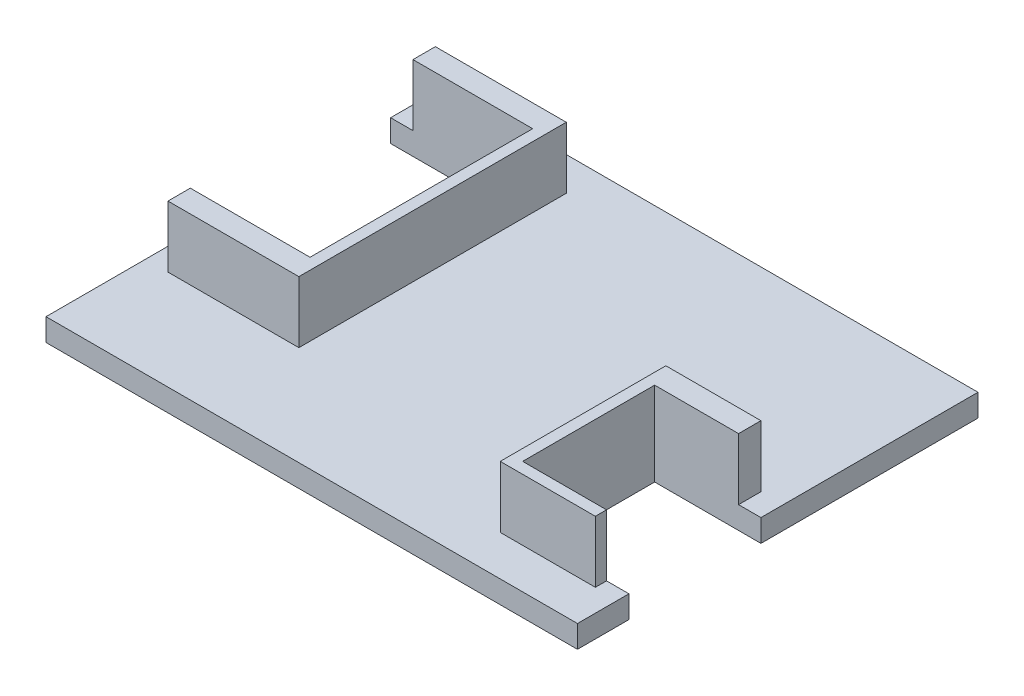
ISO-10303-21;
HEADER;
FILE_DESCRIPTION(('STEP AP214'),'2;1');
FILE_NAME('part.step','',(''),(''),'','','');
FILE_SCHEMA(('AUTOMOTIVE_DESIGN { 1 0 10303 214 1 1 1 1 }'));
ENDSEC;
DATA;
#1=APPLICATION_CONTEXT('core data for automotive mechanical design processes');
#2=APPLICATION_PROTOCOL_DEFINITION('international standard','automotive_design',2000,#1);
#3=PRODUCT_CONTEXT('',#1,'mechanical');
#4=PRODUCT('Part','Part','',(#3));
#5=PRODUCT_RELATED_PRODUCT_CATEGORY('part','',(#4));
#6=PRODUCT_DEFINITION_FORMATION('','',#4);
#7=PRODUCT_DEFINITION_CONTEXT('part definition',#1,'design');
#8=PRODUCT_DEFINITION('design','',#6,#7);
#9=PRODUCT_DEFINITION_SHAPE('','',#8);
#10=(LENGTH_UNIT() NAMED_UNIT(*) SI_UNIT(.MILLI.,.METRE.));
#11=(NAMED_UNIT(*) PLANE_ANGLE_UNIT() SI_UNIT($,.RADIAN.));
#12=(NAMED_UNIT(*) SI_UNIT($,.STERADIAN.) SOLID_ANGLE_UNIT());
#13=UNCERTAINTY_MEASURE_WITH_UNIT(LENGTH_MEASURE(1.E-05),#10,'distance_accuracy_value','');
#14=(GEOMETRIC_REPRESENTATION_CONTEXT(3) GLOBAL_UNCERTAINTY_ASSIGNED_CONTEXT((#13)) GLOBAL_UNIT_ASSIGNED_CONTEXT((#10,
#11,#12)) REPRESENTATION_CONTEXT('',''));
#15=CARTESIAN_POINT('',(0.,0.,0.));
#16=DIRECTION('',(0.,0.,1.));
#17=DIRECTION('',(1.,0.,0.));
#18=AXIS2_PLACEMENT_3D('',#15,#16,#17);
#19=CARTESIAN_POINT('',(0.,2.,0.));
#20=DIRECTION('',(0.,-1.,0.));
#21=DIRECTION('',(0.,0.,-1.));
#22=AXIS2_PLACEMENT_3D('',#19,#20,#21);
#23=PLANE('',#22);
#24=DIRECTION('',(0.,0.,1.));
#25=VECTOR('',#24,1.);
#26=CARTESIAN_POINT('',(2.,2.,-10.9));
#27=LINE('',#26,#25);
#28=CARTESIAN_POINT('',(2.,2.,-10.9));
#29=VERTEX_POINT('',#28);
#30=CARTESIAN_POINT('',(2.,2.,-8.9));
#31=VERTEX_POINT('',#30);
#32=EDGE_CURVE('E236',#29,#31,#27,.T.);
#33=ORIENTED_EDGE('',*,*,#32,.F.);
#34=DIRECTION('',(1.,0.,0.));
#35=VECTOR('',#34,1.);
#36=CARTESIAN_POINT('',(0.,2.,-10.9));
#37=LINE('',#36,#35);
#38=CARTESIAN_POINT('',(0.,2.,-10.9));
#39=VERTEX_POINT('',#38);
#40=EDGE_CURVE('E344',#39,#29,#37,.T.);
#41=ORIENTED_EDGE('',*,*,#40,.F.);
#42=DIRECTION('',(0.,0.,1.));
#43=VECTOR('',#42,1.);
#44=CARTESIAN_POINT('',(0.,2.,0.));
#45=LINE('',#44,#43);
#46=CARTESIAN_POINT('',(0.,2.,0.));
#47=VERTEX_POINT('',#46);
#48=EDGE_CURVE('E391',#39,#47,#45,.T.);
#49=ORIENTED_EDGE('',*,*,#48,.T.);
#50=DIRECTION('',(1.,0.,0.));
#51=VECTOR('',#50,1.);
#52=CARTESIAN_POINT('',(0.,2.,0.));
#53=LINE('',#52,#51);
#54=CARTESIAN_POINT('',(47.5,2.,0.));
#55=VERTEX_POINT('',#54);
#56=EDGE_CURVE('E390',#47,#55,#53,.T.);
#57=ORIENTED_EDGE('',*,*,#56,.T.);
#58=DIRECTION('',(0.,0.,-1.));
#59=VECTOR('',#58,1.);
#60=CARTESIAN_POINT('',(47.5,2.,0.));
#61=LINE('',#60,#59);
#62=CARTESIAN_POINT('',(47.5,2.,-4.6));
#63=VERTEX_POINT('',#62);
#64=EDGE_CURVE('E395',#55,#63,#61,.T.);
#65=ORIENTED_EDGE('',*,*,#64,.T.);
#66=DIRECTION('',(1.,0.,0.));
#67=VECTOR('',#66,1.);
#68=CARTESIAN_POINT('',(47.5,2.,-4.6));
#69=LINE('',#68,#67);
#70=CARTESIAN_POINT('',(45.5,2.,-4.6));
#71=VERTEX_POINT('',#70);
#72=EDGE_CURVE('E369',#71,#63,#69,.T.);
#73=ORIENTED_EDGE('',*,*,#72,.F.);
#74=DIRECTION('',(0.,0.,-1.));
#75=VECTOR('',#74,1.);
#76=CARTESIAN_POINT('',(45.5,2.,-4.6));
#77=LINE('',#76,#75);
#78=CARTESIAN_POINT('',(45.5,2.,-3.6));
#79=VERTEX_POINT('',#78);
#80=EDGE_CURVE('E313',#79,#71,#77,.T.);
#81=ORIENTED_EDGE('',*,*,#80,.F.);
#82=DIRECTION('',(1.,0.,0.));
#83=VECTOR('',#82,1.);
#84=CARTESIAN_POINT('',(37.,2.,-3.6));
#85=LINE('',#84,#83);
#86=CARTESIAN_POINT('',(37.,2.,-3.6));
#87=VERTEX_POINT('',#86);
#88=EDGE_CURVE('E308',#87,#79,#85,.T.);
#89=ORIENTED_EDGE('',*,*,#88,.F.);
#90=DIRECTION('',(0.,0.,1.));
#91=VECTOR('',#90,1.);
#92=CARTESIAN_POINT('',(37.,2.,-16.4));
#93=LINE('',#92,#91);
#94=CARTESIAN_POINT('',(37.,2.,-18.4));
#95=VERTEX_POINT('',#94);
#96=EDGE_CURVE('E336',#95,#87,#93,.T.);
#97=ORIENTED_EDGE('',*,*,#96,.F.);
#98=DIRECTION('',(-1.,0.,0.));
#99=VECTOR('',#98,1.);
#100=CARTESIAN_POINT('',(37.,2.,-18.4));
#101=LINE('',#100,#99);
#102=CARTESIAN_POINT('',(45.5,2.,-18.4));
#103=VERTEX_POINT('',#102);
#104=EDGE_CURVE('E285',#103,#95,#101,.T.);
#105=ORIENTED_EDGE('',*,*,#104,.F.);
#106=DIRECTION('',(0.,0.,-1.));
#107=VECTOR('',#106,1.);
#108=CARTESIAN_POINT('',(45.5,2.,-18.4));
#109=LINE('',#108,#107);
#110=CARTESIAN_POINT('',(45.5,2.,-16.4));
#111=VERTEX_POINT('',#110);
#112=EDGE_CURVE('E280',#111,#103,#109,.T.);
#113=ORIENTED_EDGE('',*,*,#112,.F.);
#114=DIRECTION('',(-1.,0.,0.));
#115=VECTOR('',#114,1.);
#116=CARTESIAN_POINT('',(47.5,2.,-16.4));
#117=LINE('',#116,#115);
#118=CARTESIAN_POINT('',(47.5,2.,-16.4));
#119=VERTEX_POINT('',#118);
#120=EDGE_CURVE('E358',#119,#111,#117,.T.);
#121=ORIENTED_EDGE('',*,*,#120,.F.);
#122=CARTESIAN_POINT('',(47.5,2.,-35.8));
#123=VERTEX_POINT('',#122);
#124=EDGE_CURVE('E394',#119,#123,#61,.T.);
#125=ORIENTED_EDGE('',*,*,#124,.T.);
#126=DIRECTION('',(-1.,0.,0.));
#127=VECTOR('',#126,1.);
#128=CARTESIAN_POINT('',(0.,2.,-35.8));
#129=LINE('',#128,#127);
#130=CARTESIAN_POINT('',(0.,2.,-35.8));
#131=VERTEX_POINT('',#130);
#132=EDGE_CURVE('E399',#123,#131,#129,.T.);
#133=ORIENTED_EDGE('',*,*,#132,.T.);
#134=CARTESIAN_POINT('',(0.,2.,-30.8));
#135=VERTEX_POINT('',#134);
#136=EDGE_CURVE('E386',#131,#135,#45,.T.);
#137=ORIENTED_EDGE('',*,*,#136,.T.);
#138=DIRECTION('',(-1.,0.,0.));
#139=VECTOR('',#138,1.);
#140=CARTESIAN_POINT('',(0.,2.,-30.8));
#141=LINE('',#140,#139);
#142=CARTESIAN_POINT('',(2.,2.,-30.8));
#143=VERTEX_POINT('',#142);
#144=EDGE_CURVE('E350',#143,#135,#141,.T.);
#145=ORIENTED_EDGE('',*,*,#144,.F.);
#146=DIRECTION('',(0.,0.,1.));
#147=VECTOR('',#146,1.);
#148=CARTESIAN_POINT('',(2.,2.,-32.8));
#149=LINE('',#148,#147);
#150=CARTESIAN_POINT('',(2.,2.,-32.8));
#151=VERTEX_POINT('',#150);
#152=EDGE_CURVE('E63',#151,#143,#149,.T.);
#153=ORIENTED_EDGE('',*,*,#152,.F.);
#154=DIRECTION('',(-1.,0.,0.));
#155=VECTOR('',#154,1.);
#156=CARTESIAN_POINT('',(2.,2.,-32.8));
#157=LINE('',#156,#155);
#158=CARTESIAN_POINT('',(13.7,2.,-32.8));
#159=VERTEX_POINT('',#158);
#160=EDGE_CURVE('E263',#159,#151,#157,.T.);
#161=ORIENTED_EDGE('',*,*,#160,.F.);
#162=DIRECTION('',(0.,0.,-1.));
#163=VECTOR('',#162,1.);
#164=CARTESIAN_POINT('',(13.7,2.,-32.8));
#165=LINE('',#164,#163);
#166=CARTESIAN_POINT('',(13.7,2.,-8.9));
#167=VERTEX_POINT('',#166);
#168=EDGE_CURVE('E239',#167,#159,#165,.T.);
#169=ORIENTED_EDGE('',*,*,#168,.F.);
#170=DIRECTION('',(1.,0.,0.));
#171=VECTOR('',#170,1.);
#172=CARTESIAN_POINT('',(2.,2.,-8.9));
#173=LINE('',#172,#171);
#174=EDGE_CURVE('E232',#31,#167,#173,.T.);
#175=ORIENTED_EDGE('',*,*,#174,.F.);
#176=EDGE_LOOP('',(#33,#41,#49,#57,#65,#73,#81,#89,#97,#105,#113,#121,#125,#133,#137,#145,#153,
#161,#169,#175));
#177=FACE_BOUND('',#176,.T.);
#178=ADVANCED_FACE('F47',(#177),#23,.F.);
#179=CARTESIAN_POINT('',(0.,2.,0.));
#180=DIRECTION('',(1.,0.,0.));
#181=DIRECTION('',(0.,0.,-1.));
#182=AXIS2_PLACEMENT_3D('',#179,#180,#181);
#183=PLANE('',#182);
#184=DIRECTION('',(0.,0.,1.));
#185=VECTOR('',#184,1.);
#186=CARTESIAN_POINT('',(0.,0.,0.));
#187=LINE('',#186,#185);
#188=CARTESIAN_POINT('',(0.,0.,-35.8));
#189=VERTEX_POINT('',#188);
#190=CARTESIAN_POINT('',(0.,0.,-30.8));
#191=VERTEX_POINT('',#190);
#192=EDGE_CURVE('E403',#189,#191,#187,.T.);
#193=ORIENTED_EDGE('',*,*,#192,.T.);
#194=DIRECTION('',(0.,1.,0.));
#195=VECTOR('',#194,1.);
#196=CARTESIAN_POINT('',(0.,-8.,-30.8));
#197=LINE('',#196,#195);
#198=EDGE_CURVE('E354',#191,#135,#197,.T.);
#199=ORIENTED_EDGE('',*,*,#198,.T.);
#200=ORIENTED_EDGE('',*,*,#136,.F.);
#201=DIRECTION('',(0.,-1.,0.));
#202=VECTOR('',#201,1.);
#203=CARTESIAN_POINT('',(0.,2.,-35.8));
#204=LINE('',#203,#202);
#205=EDGE_CURVE('E402',#131,#189,#204,.T.);
#206=ORIENTED_EDGE('',*,*,#205,.T.);
#207=EDGE_LOOP('',(#193,#199,#200,#206));
#208=FACE_BOUND('',#207,.T.);
#209=ADVANCED_FACE('F482',(#208),#183,.F.);
#210=CARTESIAN_POINT('',(47.5,2.,0.));
#211=DIRECTION('',(-1.,0.,0.));
#212=DIRECTION('',(0.,0.,1.));
#213=AXIS2_PLACEMENT_3D('',#210,#211,#212);
#214=PLANE('',#213);
#215=DIRECTION('',(0.,0.,-1.));
#216=VECTOR('',#215,1.);
#217=CARTESIAN_POINT('',(47.5,0.,0.));
#218=LINE('',#217,#216);
#219=CARTESIAN_POINT('',(47.5,0.,0.));
#220=VERTEX_POINT('',#219);
#221=CARTESIAN_POINT('',(47.5,0.,-4.6));
#222=VERTEX_POINT('',#221);
#223=EDGE_CURVE('E411',#220,#222,#218,.T.);
#224=ORIENTED_EDGE('',*,*,#223,.T.);
#225=DIRECTION('',(0.,1.,0.));
#226=VECTOR('',#225,1.);
#227=CARTESIAN_POINT('',(47.5,-8.,-4.6));
#228=LINE('',#227,#226);
#229=EDGE_CURVE('E373',#222,#63,#228,.T.);
#230=ORIENTED_EDGE('',*,*,#229,.T.);
#231=ORIENTED_EDGE('',*,*,#64,.F.);
#232=DIRECTION('',(0.,-1.,0.));
#233=VECTOR('',#232,1.);
#234=CARTESIAN_POINT('',(47.5,2.,0.));
#235=LINE('',#234,#233);
#236=EDGE_CURVE('E425',#55,#220,#235,.T.);
#237=ORIENTED_EDGE('',*,*,#236,.T.);
#238=EDGE_LOOP('',(#224,#230,#231,#237));
#239=FACE_BOUND('',#238,.T.);
#240=ADVANCED_FACE('F518',(#239),#214,.F.);
#241=ORIENTED_EDGE('',*,*,#48,.F.);
#242=DIRECTION('',(0.,1.,0.));
#243=VECTOR('',#242,1.);
#244=CARTESIAN_POINT('',(0.,-8.,-10.9));
#245=LINE('',#244,#243);
#246=CARTESIAN_POINT('',(0.,0.,-10.9));
#247=VERTEX_POINT('',#246);
#248=EDGE_CURVE('E353',#247,#39,#245,.T.);
#249=ORIENTED_EDGE('',*,*,#248,.F.);
#250=CARTESIAN_POINT('',(0.,0.,0.));
#251=VERTEX_POINT('',#250);
#252=EDGE_CURVE('E377',#247,#251,#187,.T.);
#253=ORIENTED_EDGE('',*,*,#252,.T.);
#254=DIRECTION('',(0.,-1.,0.));
#255=VECTOR('',#254,1.);
#256=CARTESIAN_POINT('',(0.,2.,0.));
#257=LINE('',#256,#255);
#258=EDGE_CURVE('E429',#47,#251,#257,.T.);
#259=ORIENTED_EDGE('',*,*,#258,.F.);
#260=EDGE_LOOP('',(#241,#249,#253,#259));
#261=FACE_BOUND('',#260,.T.);
#262=ADVANCED_FACE('F49',(#261),#183,.F.);
#263=CARTESIAN_POINT('',(0.,2.,0.));
#264=DIRECTION('',(0.,0.,-1.));
#265=DIRECTION('',(-1.,0.,0.));
#266=AXIS2_PLACEMENT_3D('',#263,#264,#265);
#267=PLANE('',#266);
#268=DIRECTION('',(1.,0.,0.));
#269=VECTOR('',#268,1.);
#270=CARTESIAN_POINT('',(0.,0.,0.));
#271=LINE('',#270,#269);
#272=EDGE_CURVE('E407',#251,#220,#271,.T.);
#273=ORIENTED_EDGE('',*,*,#272,.T.);
#274=ORIENTED_EDGE('',*,*,#236,.F.);
#275=ORIENTED_EDGE('',*,*,#56,.F.);
#276=ORIENTED_EDGE('',*,*,#258,.T.);
#277=EDGE_LOOP('',(#273,#274,#275,#276));
#278=FACE_BOUND('',#277,.T.);
#279=ADVANCED_FACE('F520',(#278),#267,.F.);
#280=ORIENTED_EDGE('',*,*,#124,.F.);
#281=DIRECTION('',(0.,1.,0.));
#282=VECTOR('',#281,1.);
#283=CARTESIAN_POINT('',(47.5,-8.,-16.4));
#284=LINE('',#283,#282);
#285=CARTESIAN_POINT('',(47.5,0.,-16.4));
#286=VERTEX_POINT('',#285);
#287=EDGE_CURVE('E372',#286,#119,#284,.T.);
#288=ORIENTED_EDGE('',*,*,#287,.F.);
#289=CARTESIAN_POINT('',(47.5,0.,-35.8));
#290=VERTEX_POINT('',#289);
#291=EDGE_CURVE('E410',#286,#290,#218,.T.);
#292=ORIENTED_EDGE('',*,*,#291,.T.);
#293=DIRECTION('',(0.,-1.,0.));
#294=VECTOR('',#293,1.);
#295=CARTESIAN_POINT('',(47.5,2.,-35.8));
#296=LINE('',#295,#294);
#297=EDGE_CURVE('E421',#123,#290,#296,.T.);
#298=ORIENTED_EDGE('',*,*,#297,.F.);
#299=EDGE_LOOP('',(#280,#288,#292,#298));
#300=FACE_BOUND('',#299,.T.);
#301=ADVANCED_FACE('F473',(#300),#214,.F.);
#302=CARTESIAN_POINT('',(0.,2.,-35.8));
#303=DIRECTION('',(0.,0.,1.));
#304=DIRECTION('',(1.,0.,0.));
#305=AXIS2_PLACEMENT_3D('',#302,#303,#304);
#306=PLANE('',#305);
#307=DIRECTION('',(-1.,0.,0.));
#308=VECTOR('',#307,1.);
#309=CARTESIAN_POINT('',(0.,0.,-35.8));
#310=LINE('',#309,#308);
#311=EDGE_CURVE('E415',#290,#189,#310,.T.);
#312=ORIENTED_EDGE('',*,*,#311,.T.);
#313=ORIENTED_EDGE('',*,*,#205,.F.);
#314=ORIENTED_EDGE('',*,*,#132,.F.);
#315=ORIENTED_EDGE('',*,*,#297,.T.);
#316=EDGE_LOOP('',(#312,#313,#314,#315));
#317=FACE_BOUND('',#316,.T.);
#318=ADVANCED_FACE('F478',(#317),#306,.F.);
#319=CARTESIAN_POINT('',(0.,0.,0.));
#320=DIRECTION('',(0.,-1.,0.));
#321=DIRECTION('',(0.,0.,-1.));
#322=AXIS2_PLACEMENT_3D('',#319,#320,#321);
#323=PLANE('',#322);
#324=DIRECTION('',(1.,0.,0.));
#325=VECTOR('',#324,1.);
#326=CARTESIAN_POINT('',(0.,0.,-30.8));
#327=LINE('',#326,#325);
#328=CARTESIAN_POINT('',(12.7,0.,-30.8));
#329=VERTEX_POINT('',#328);
#330=EDGE_CURVE('E11',#191,#329,#327,.T.);
#331=ORIENTED_EDGE('',*,*,#330,.F.);
#332=ORIENTED_EDGE('',*,*,#192,.F.);
#333=ORIENTED_EDGE('',*,*,#311,.F.);
#334=ORIENTED_EDGE('',*,*,#291,.F.);
#335=DIRECTION('',(1.,0.,0.));
#336=VECTOR('',#335,1.);
#337=CARTESIAN_POINT('',(0.,0.,-16.4));
#338=LINE('',#337,#336);
#339=CARTESIAN_POINT('',(38.,0.,-16.4));
#340=VERTEX_POINT('',#339);
#341=EDGE_CURVE('E433',#340,#286,#338,.T.);
#342=ORIENTED_EDGE('',*,*,#341,.F.);
#343=DIRECTION('',(0.,0.,-1.));
#344=VECTOR('',#343,1.);
#345=CARTESIAN_POINT('',(38.,0.,0.));
#346=LINE('',#345,#344);
#347=CARTESIAN_POINT('',(38.,0.,-4.6));
#348=VERTEX_POINT('',#347);
#349=EDGE_CURVE('E436',#348,#340,#346,.T.);
#350=ORIENTED_EDGE('',*,*,#349,.F.);
#351=DIRECTION('',(-1.,0.,0.));
#352=VECTOR('',#351,1.);
#353=CARTESIAN_POINT('',(0.,0.,-4.6));
#354=LINE('',#353,#352);
#355=EDGE_CURVE('E440',#222,#348,#354,.T.);
#356=ORIENTED_EDGE('',*,*,#355,.F.);
#357=ORIENTED_EDGE('',*,*,#223,.F.);
#358=ORIENTED_EDGE('',*,*,#272,.F.);
#359=ORIENTED_EDGE('',*,*,#252,.F.);
#360=DIRECTION('',(-1.,0.,0.));
#361=VECTOR('',#360,1.);
#362=CARTESIAN_POINT('',(0.,0.,-10.9));
#363=LINE('',#362,#361);
#364=CARTESIAN_POINT('',(12.7,0.,-10.9));
#365=VERTEX_POINT('',#364);
#366=EDGE_CURVE('E443',#365,#247,#363,.T.);
#367=ORIENTED_EDGE('',*,*,#366,.F.);
#368=DIRECTION('',(0.,0.,1.));
#369=VECTOR('',#368,1.);
#370=CARTESIAN_POINT('',(12.7,0.,0.));
#371=LINE('',#370,#369);
#372=EDGE_CURVE('E56',#329,#365,#371,.T.);
#373=ORIENTED_EDGE('',*,*,#372,.F.);
#374=EDGE_LOOP('',(#331,#332,#333,#334,#342,#350,#356,#357,#358,#359,#367,#373));
#375=FACE_BOUND('',#374,.T.);
#376=ADVANCED_FACE('F455',(#375),#323,.T.);
#377=CARTESIAN_POINT('',(47.5,-8.,-4.6));
#378=DIRECTION('',(0.,0.,1.));
#379=DIRECTION('',(1.,0.,0.));
#380=AXIS2_PLACEMENT_3D('',#377,#378,#379);
#381=PLANE('',#380);
#382=ORIENTED_EDGE('',*,*,#355,.T.);
#383=DIRECTION('',(0.,1.,0.));
#384=VECTOR('',#383,1.);
#385=CARTESIAN_POINT('',(38.,-8.,-4.6));
#386=LINE('',#385,#384);
#387=CARTESIAN_POINT('',(38.,7.5,-4.6));
#388=VERTEX_POINT('',#387);
#389=EDGE_CURVE('E378',#348,#388,#386,.T.);
#390=ORIENTED_EDGE('',*,*,#389,.T.);
#391=DIRECTION('',(-1.,0.,0.));
#392=VECTOR('',#391,1.);
#393=CARTESIAN_POINT('',(37.,7.5,-4.6));
#394=LINE('',#393,#392);
#395=CARTESIAN_POINT('',(45.5,7.5,-4.6));
#396=VERTEX_POINT('',#395);
#397=EDGE_CURVE('E316',#396,#388,#394,.T.);
#398=ORIENTED_EDGE('',*,*,#397,.F.);
#399=DIRECTION('',(0.,-1.,0.));
#400=VECTOR('',#399,1.);
#401=CARTESIAN_POINT('',(45.5,7.5,-4.6));
#402=LINE('',#401,#400);
#403=EDGE_CURVE('E320',#396,#71,#402,.T.);
#404=ORIENTED_EDGE('',*,*,#403,.T.);
#405=ORIENTED_EDGE('',*,*,#72,.T.);
#406=ORIENTED_EDGE('',*,*,#229,.F.);
#407=EDGE_LOOP('',(#382,#390,#398,#404,#405,#406));
#408=FACE_BOUND('',#407,.T.);
#409=ADVANCED_FACE('F503',(#408),#381,.F.);
#410=CARTESIAN_POINT('',(38.,-8.,-16.4));
#411=DIRECTION('',(-1.,0.,0.));
#412=DIRECTION('',(0.,0.,1.));
#413=AXIS2_PLACEMENT_3D('',#410,#411,#412);
#414=PLANE('',#413);
#415=ORIENTED_EDGE('',*,*,#349,.T.);
#416=DIRECTION('',(0.,1.,0.));
#417=VECTOR('',#416,1.);
#418=CARTESIAN_POINT('',(38.,-8.,-16.4));
#419=LINE('',#418,#417);
#420=CARTESIAN_POINT('',(38.,7.5,-16.4));
#421=VERTEX_POINT('',#420);
#422=EDGE_CURVE('E381',#340,#421,#419,.T.);
#423=ORIENTED_EDGE('',*,*,#422,.T.);
#424=DIRECTION('',(0.,0.,-1.));
#425=VECTOR('',#424,1.);
#426=CARTESIAN_POINT('',(38.,7.5,-16.4));
#427=LINE('',#426,#425);
#428=EDGE_CURVE('E337',#388,#421,#427,.T.);
#429=ORIENTED_EDGE('',*,*,#428,.F.);
#430=ORIENTED_EDGE('',*,*,#389,.F.);
#431=EDGE_LOOP('',(#415,#423,#429,#430));
#432=FACE_BOUND('',#431,.T.);
#433=ADVANCED_FACE('F499',(#432),#414,.F.);
#434=CARTESIAN_POINT('',(47.5,-8.,-16.4));
#435=DIRECTION('',(0.,0.,-1.));
#436=DIRECTION('',(-1.,0.,0.));
#437=AXIS2_PLACEMENT_3D('',#434,#435,#436);
#438=PLANE('',#437);
#439=ORIENTED_EDGE('',*,*,#341,.T.);
#440=ORIENTED_EDGE('',*,*,#287,.T.);
#441=ORIENTED_EDGE('',*,*,#120,.T.);
#442=DIRECTION('',(0.,-1.,0.));
#443=VECTOR('',#442,1.);
#444=CARTESIAN_POINT('',(45.5,7.5,-16.4));
#445=LINE('',#444,#443);
#446=CARTESIAN_POINT('',(45.5,7.5,-16.4));
#447=VERTEX_POINT('',#446);
#448=EDGE_CURVE('E305',#447,#111,#445,.T.);
#449=ORIENTED_EDGE('',*,*,#448,.F.);
#450=DIRECTION('',(1.,0.,0.));
#451=VECTOR('',#450,1.);
#452=CARTESIAN_POINT('',(37.,7.5,-16.4));
#453=LINE('',#452,#451);
#454=EDGE_CURVE('E281',#421,#447,#453,.T.);
#455=ORIENTED_EDGE('',*,*,#454,.F.);
#456=ORIENTED_EDGE('',*,*,#422,.F.);
#457=EDGE_LOOP('',(#439,#440,#441,#449,#455,#456));
#458=FACE_BOUND('',#457,.T.);
#459=ADVANCED_FACE('F491',(#458),#438,.F.);
#460=CARTESIAN_POINT('',(0.,-8.,-30.8));
#461=DIRECTION('',(0.,0.,-1.));
#462=DIRECTION('',(-1.,0.,0.));
#463=AXIS2_PLACEMENT_3D('',#460,#461,#462);
#464=PLANE('',#463);
#465=ORIENTED_EDGE('',*,*,#330,.T.);
#466=DIRECTION('',(0.,1.,0.));
#467=VECTOR('',#466,1.);
#468=CARTESIAN_POINT('',(12.7,-8.,-30.8));
#469=LINE('',#468,#467);
#470=CARTESIAN_POINT('',(12.7,7.5,-30.8));
#471=VERTEX_POINT('',#470);
#472=EDGE_CURVE('E359',#329,#471,#469,.T.);
#473=ORIENTED_EDGE('',*,*,#472,.T.);
#474=DIRECTION('',(1.,0.,0.));
#475=VECTOR('',#474,1.);
#476=CARTESIAN_POINT('',(2.,7.5,-30.8));
#477=LINE('',#476,#475);
#478=CARTESIAN_POINT('',(2.,7.5,-30.8));
#479=VERTEX_POINT('',#478);
#480=EDGE_CURVE('E262',#479,#471,#477,.T.);
#481=ORIENTED_EDGE('',*,*,#480,.F.);
#482=DIRECTION('',(0.,-1.,0.));
#483=VECTOR('',#482,1.);
#484=CARTESIAN_POINT('',(2.,7.5,-30.8));
#485=LINE('',#484,#483);
#486=EDGE_CURVE('E277',#479,#143,#485,.T.);
#487=ORIENTED_EDGE('',*,*,#486,.T.);
#488=ORIENTED_EDGE('',*,*,#144,.T.);
#489=ORIENTED_EDGE('',*,*,#198,.F.);
#490=EDGE_LOOP('',(#465,#473,#481,#487,#488,#489));
#491=FACE_BOUND('',#490,.T.);
#492=ADVANCED_FACE('F611',(#491),#464,.F.);
#493=CARTESIAN_POINT('',(12.7,-8.,-30.8));
#494=DIRECTION('',(1.,0.,0.));
#495=DIRECTION('',(0.,0.,-1.));
#496=AXIS2_PLACEMENT_3D('',#493,#494,#495);
#497=PLANE('',#496);
#498=ORIENTED_EDGE('',*,*,#372,.T.);
#499=DIRECTION('',(0.,1.,0.));
#500=VECTOR('',#499,1.);
#501=CARTESIAN_POINT('',(12.7,-8.,-10.9));
#502=LINE('',#501,#500);
#503=CARTESIAN_POINT('',(12.7,7.5,-10.9));
#504=VERTEX_POINT('',#503);
#505=EDGE_CURVE('E71',#365,#504,#502,.T.);
#506=ORIENTED_EDGE('',*,*,#505,.T.);
#507=DIRECTION('',(0.,0.,1.));
#508=VECTOR('',#507,1.);
#509=CARTESIAN_POINT('',(12.7,7.5,-32.8));
#510=LINE('',#509,#508);
#511=EDGE_CURVE('E244',#471,#504,#510,.T.);
#512=ORIENTED_EDGE('',*,*,#511,.F.);
#513=ORIENTED_EDGE('',*,*,#472,.F.);
#514=EDGE_LOOP('',(#498,#506,#512,#513));
#515=FACE_BOUND('',#514,.T.);
#516=ADVANCED_FACE('F450',(#515),#497,.F.);
#517=CARTESIAN_POINT('',(0.,-8.,-10.9));
#518=DIRECTION('',(0.,0.,1.));
#519=DIRECTION('',(1.,0.,0.));
#520=AXIS2_PLACEMENT_3D('',#517,#518,#519);
#521=PLANE('',#520);
#522=ORIENTED_EDGE('',*,*,#366,.T.);
#523=ORIENTED_EDGE('',*,*,#248,.T.);
#524=ORIENTED_EDGE('',*,*,#40,.T.);
#525=DIRECTION('',(0.,-1.,0.));
#526=VECTOR('',#525,1.);
#527=CARTESIAN_POINT('',(2.,7.5,-10.9));
#528=LINE('',#527,#526);
#529=CARTESIAN_POINT('',(2.,7.5,-10.9));
#530=VERTEX_POINT('',#529);
#531=EDGE_CURVE('E246',#530,#29,#528,.T.);
#532=ORIENTED_EDGE('',*,*,#531,.F.);
#533=DIRECTION('',(-1.,0.,0.));
#534=VECTOR('',#533,1.);
#535=CARTESIAN_POINT('',(2.,7.5,-10.9));
#536=LINE('',#535,#534);
#537=EDGE_CURVE('E222',#504,#530,#536,.T.);
#538=ORIENTED_EDGE('',*,*,#537,.F.);
#539=ORIENTED_EDGE('',*,*,#505,.F.);
#540=EDGE_LOOP('',(#522,#523,#524,#532,#538,#539));
#541=FACE_BOUND('',#540,.T.);
#542=ADVANCED_FACE('F458',(#541),#521,.F.);
#543=CARTESIAN_POINT('',(37.,7.5,-16.4));
#544=DIRECTION('',(1.,0.,0.));
#545=DIRECTION('',(0.,0.,-1.));
#546=AXIS2_PLACEMENT_3D('',#543,#544,#545);
#547=PLANE('',#546);
#548=ORIENTED_EDGE('',*,*,#96,.T.);
#549=DIRECTION('',(0.,-1.,0.));
#550=VECTOR('',#549,1.);
#551=CARTESIAN_POINT('',(37.,7.5,-3.6));
#552=LINE('',#551,#550);
#553=CARTESIAN_POINT('',(37.,7.5,-3.6));
#554=VERTEX_POINT('',#553);
#555=EDGE_CURVE('E332',#554,#87,#552,.T.);
#556=ORIENTED_EDGE('',*,*,#555,.F.);
#557=DIRECTION('',(0.,0.,1.));
#558=VECTOR('',#557,1.);
#559=CARTESIAN_POINT('',(37.,7.5,-16.4));
#560=LINE('',#559,#558);
#561=CARTESIAN_POINT('',(37.,7.5,-18.4));
#562=VERTEX_POINT('',#561);
#563=EDGE_CURVE('E341',#562,#554,#560,.T.);
#564=ORIENTED_EDGE('',*,*,#563,.F.);
#565=DIRECTION('',(0.,-1.,0.));
#566=VECTOR('',#565,1.);
#567=CARTESIAN_POINT('',(37.,7.5,-18.4));
#568=LINE('',#567,#566);
#569=EDGE_CURVE('E292',#562,#95,#568,.T.);
#570=ORIENTED_EDGE('',*,*,#569,.T.);
#571=EDGE_LOOP('',(#548,#556,#564,#570));
#572=FACE_BOUND('',#571,.T.);
#573=ADVANCED_FACE('F616',(#572),#547,.F.);
#574=CARTESIAN_POINT('',(0.,7.5,0.));
#575=DIRECTION('',(0.,-1.,0.));
#576=DIRECTION('',(0.,0.,-1.));
#577=AXIS2_PLACEMENT_3D('',#574,#575,#576);
#578=PLANE('',#577);
#579=ORIENTED_EDGE('',*,*,#428,.T.);
#580=ORIENTED_EDGE('',*,*,#454,.T.);
#581=DIRECTION('',(0.,0.,-1.));
#582=VECTOR('',#581,1.);
#583=CARTESIAN_POINT('',(45.5,7.5,-18.4));
#584=LINE('',#583,#582);
#585=CARTESIAN_POINT('',(45.5,7.5,-18.4));
#586=VERTEX_POINT('',#585);
#587=EDGE_CURVE('E284',#447,#586,#584,.T.);
#588=ORIENTED_EDGE('',*,*,#587,.T.);
#589=DIRECTION('',(-1.,0.,0.));
#590=VECTOR('',#589,1.);
#591=CARTESIAN_POINT('',(37.,7.5,-18.4));
#592=LINE('',#591,#590);
#593=EDGE_CURVE('E288',#586,#562,#592,.T.);
#594=ORIENTED_EDGE('',*,*,#593,.T.);
#595=ORIENTED_EDGE('',*,*,#563,.T.);
#596=DIRECTION('',(1.,0.,0.));
#597=VECTOR('',#596,1.);
#598=CARTESIAN_POINT('',(37.,7.5,-3.6));
#599=LINE('',#598,#597);
#600=CARTESIAN_POINT('',(45.5,7.5,-3.6));
#601=VERTEX_POINT('',#600);
#602=EDGE_CURVE('E309',#554,#601,#599,.T.);
#603=ORIENTED_EDGE('',*,*,#602,.T.);
#604=DIRECTION('',(0.,0.,-1.));
#605=VECTOR('',#604,1.);
#606=CARTESIAN_POINT('',(45.5,7.5,-4.6));
#607=LINE('',#606,#605);
#608=EDGE_CURVE('E312',#601,#396,#607,.T.);
#609=ORIENTED_EDGE('',*,*,#608,.T.);
#610=ORIENTED_EDGE('',*,*,#397,.T.);
#611=EDGE_LOOP('',(#579,#580,#588,#594,#595,#603,#609,#610));
#612=FACE_BOUND('',#611,.T.);
#613=ADVANCED_FACE('F505',(#612),#578,.F.);
#614=CARTESIAN_POINT('',(37.,7.5,-3.6));
#615=DIRECTION('',(0.,0.,-1.));
#616=DIRECTION('',(-1.,0.,0.));
#617=AXIS2_PLACEMENT_3D('',#614,#615,#616);
#618=PLANE('',#617);
#619=ORIENTED_EDGE('',*,*,#88,.T.);
#620=DIRECTION('',(0.,-1.,0.));
#621=VECTOR('',#620,1.);
#622=CARTESIAN_POINT('',(45.5,7.5,-3.6));
#623=LINE('',#622,#621);
#624=EDGE_CURVE('E328',#601,#79,#623,.T.);
#625=ORIENTED_EDGE('',*,*,#624,.F.);
#626=ORIENTED_EDGE('',*,*,#602,.F.);
#627=ORIENTED_EDGE('',*,*,#555,.T.);
#628=EDGE_LOOP('',(#619,#625,#626,#627));
#629=FACE_BOUND('',#628,.T.);
#630=ADVANCED_FACE('F582',(#629),#618,.F.);
#631=CARTESIAN_POINT('',(45.5,7.5,-4.6));
#632=DIRECTION('',(-1.,0.,0.));
#633=DIRECTION('',(0.,0.,1.));
#634=AXIS2_PLACEMENT_3D('',#631,#632,#633);
#635=PLANE('',#634);
#636=ORIENTED_EDGE('',*,*,#80,.T.);
#637=ORIENTED_EDGE('',*,*,#403,.F.);
#638=ORIENTED_EDGE('',*,*,#608,.F.);
#639=ORIENTED_EDGE('',*,*,#624,.T.);
#640=EDGE_LOOP('',(#636,#637,#638,#639));
#641=FACE_BOUND('',#640,.T.);
#642=ADVANCED_FACE('F511',(#641),#635,.F.);
#643=CARTESIAN_POINT('',(45.5,7.5,-18.4));
#644=DIRECTION('',(-1.,0.,0.));
#645=DIRECTION('',(0.,0.,1.));
#646=AXIS2_PLACEMENT_3D('',#643,#644,#645);
#647=PLANE('',#646);
#648=ORIENTED_EDGE('',*,*,#112,.T.);
#649=DIRECTION('',(0.,-1.,0.));
#650=VECTOR('',#649,1.);
#651=CARTESIAN_POINT('',(45.5,7.5,-18.4));
#652=LINE('',#651,#650);
#653=EDGE_CURVE('E301',#586,#103,#652,.T.);
#654=ORIENTED_EDGE('',*,*,#653,.F.);
#655=ORIENTED_EDGE('',*,*,#587,.F.);
#656=ORIENTED_EDGE('',*,*,#448,.T.);
#657=EDGE_LOOP('',(#648,#654,#655,#656));
#658=FACE_BOUND('',#657,.T.);
#659=ADVANCED_FACE('F595',(#658),#647,.F.);
#660=CARTESIAN_POINT('',(37.,7.5,-18.4));
#661=DIRECTION('',(0.,0.,1.));
#662=DIRECTION('',(1.,0.,0.));
#663=AXIS2_PLACEMENT_3D('',#660,#661,#662);
#664=PLANE('',#663);
#665=ORIENTED_EDGE('',*,*,#104,.T.);
#666=ORIENTED_EDGE('',*,*,#569,.F.);
#667=ORIENTED_EDGE('',*,*,#593,.F.);
#668=ORIENTED_EDGE('',*,*,#653,.T.);
#669=EDGE_LOOP('',(#665,#666,#667,#668));
#670=FACE_BOUND('',#669,.T.);
#671=ADVANCED_FACE('F632',(#670),#664,.F.);
#672=CARTESIAN_POINT('',(2.,7.5,-32.8));
#673=DIRECTION('',(1.,0.,0.));
#674=DIRECTION('',(0.,0.,-1.));
#675=AXIS2_PLACEMENT_3D('',#672,#673,#674);
#676=PLANE('',#675);
#677=ORIENTED_EDGE('',*,*,#152,.T.);
#678=ORIENTED_EDGE('',*,*,#486,.F.);
#679=DIRECTION('',(0.,0.,1.));
#680=VECTOR('',#679,1.);
#681=CARTESIAN_POINT('',(2.,7.5,-32.8));
#682=LINE('',#681,#680);
#683=CARTESIAN_POINT('',(2.,7.5,-32.8));
#684=VERTEX_POINT('',#683);
#685=EDGE_CURVE('E259',#684,#479,#682,.T.);
#686=ORIENTED_EDGE('',*,*,#685,.F.);
#687=DIRECTION('',(0.,-1.,0.));
#688=VECTOR('',#687,1.);
#689=CARTESIAN_POINT('',(2.,7.5,-32.8));
#690=LINE('',#689,#688);
#691=EDGE_CURVE('E270',#684,#151,#690,.T.);
#692=ORIENTED_EDGE('',*,*,#691,.T.);
#693=EDGE_LOOP('',(#677,#678,#686,#692));
#694=FACE_BOUND('',#693,.T.);
#695=ADVANCED_FACE('F641',(#694),#676,.F.);
#696=CARTESIAN_POINT('',(2.,7.5,-32.8));
#697=DIRECTION('',(0.,0.,1.));
#698=DIRECTION('',(1.,0.,0.));
#699=AXIS2_PLACEMENT_3D('',#696,#697,#698);
#700=PLANE('',#699);
#701=ORIENTED_EDGE('',*,*,#160,.T.);
#702=ORIENTED_EDGE('',*,*,#691,.F.);
#703=DIRECTION('',(-1.,0.,0.));
#704=VECTOR('',#703,1.);
#705=CARTESIAN_POINT('',(2.,7.5,-32.8));
#706=LINE('',#705,#704);
#707=CARTESIAN_POINT('',(13.7,7.5,-32.8));
#708=VERTEX_POINT('',#707);
#709=EDGE_CURVE('E267',#708,#684,#706,.T.);
#710=ORIENTED_EDGE('',*,*,#709,.F.);
#711=DIRECTION('',(0.,-1.,0.));
#712=VECTOR('',#711,1.);
#713=CARTESIAN_POINT('',(13.7,7.5,-32.8));
#714=LINE('',#713,#712);
#715=EDGE_CURVE('E254',#708,#159,#714,.T.);
#716=ORIENTED_EDGE('',*,*,#715,.T.);
#717=EDGE_LOOP('',(#701,#702,#710,#716));
#718=FACE_BOUND('',#717,.T.);
#719=ADVANCED_FACE('F651',(#718),#700,.F.);
#720=CARTESIAN_POINT('',(0.,7.5,0.));
#721=DIRECTION('',(0.,1.,0.));
#722=DIRECTION('',(0.,0.,1.));
#723=AXIS2_PLACEMENT_3D('',#720,#721,#722);
#724=PLANE('',#723);
#725=ORIENTED_EDGE('',*,*,#685,.T.);
#726=ORIENTED_EDGE('',*,*,#480,.T.);
#727=ORIENTED_EDGE('',*,*,#511,.T.);
#728=ORIENTED_EDGE('',*,*,#537,.T.);
#729=DIRECTION('',(0.,0.,1.));
#730=VECTOR('',#729,1.);
#731=CARTESIAN_POINT('',(2.,7.5,-10.9));
#732=LINE('',#731,#730);
#733=CARTESIAN_POINT('',(2.,7.5,-8.9));
#734=VERTEX_POINT('',#733);
#735=EDGE_CURVE('E223',#530,#734,#732,.T.);
#736=ORIENTED_EDGE('',*,*,#735,.T.);
#737=DIRECTION('',(1.,0.,0.));
#738=VECTOR('',#737,1.);
#739=CARTESIAN_POINT('',(2.,7.5,-8.9));
#740=LINE('',#739,#738);
#741=CARTESIAN_POINT('',(13.7,7.5,-8.9));
#742=VERTEX_POINT('',#741);
#743=EDGE_CURVE('E210',#734,#742,#740,.T.);
#744=ORIENTED_EDGE('',*,*,#743,.T.);
#745=DIRECTION('',(0.,0.,-1.));
#746=VECTOR('',#745,1.);
#747=CARTESIAN_POINT('',(13.7,7.5,-32.8));
#748=LINE('',#747,#746);
#749=EDGE_CURVE('E252',#742,#708,#748,.T.);
#750=ORIENTED_EDGE('',*,*,#749,.T.);
#751=ORIENTED_EDGE('',*,*,#709,.T.);
#752=EDGE_LOOP('',(#725,#726,#727,#728,#736,#744,#750,#751));
#753=FACE_BOUND('',#752,.T.);
#754=ADVANCED_FACE('F227',(#753),#724,.T.);
#755=CARTESIAN_POINT('',(13.7,7.5,-32.8));
#756=DIRECTION('',(-1.,0.,0.));
#757=DIRECTION('',(0.,0.,1.));
#758=AXIS2_PLACEMENT_3D('',#755,#756,#757);
#759=PLANE('',#758);
#760=ORIENTED_EDGE('',*,*,#168,.T.);
#761=ORIENTED_EDGE('',*,*,#715,.F.);
#762=ORIENTED_EDGE('',*,*,#749,.F.);
#763=DIRECTION('',(0.,-1.,0.));
#764=VECTOR('',#763,1.);
#765=CARTESIAN_POINT('',(13.7,7.5,-8.9));
#766=LINE('',#765,#764);
#767=EDGE_CURVE('E218',#742,#167,#766,.T.);
#768=ORIENTED_EDGE('',*,*,#767,.T.);
#769=EDGE_LOOP('',(#760,#761,#762,#768));
#770=FACE_BOUND('',#769,.T.);
#771=ADVANCED_FACE('F683',(#770),#759,.F.);
#772=CARTESIAN_POINT('',(2.,7.5,-10.9));
#773=DIRECTION('',(1.,0.,0.));
#774=DIRECTION('',(0.,0.,-1.));
#775=AXIS2_PLACEMENT_3D('',#772,#773,#774);
#776=PLANE('',#775);
#777=ORIENTED_EDGE('',*,*,#32,.T.);
#778=DIRECTION('',(0.,-1.,0.));
#779=VECTOR('',#778,1.);
#780=CARTESIAN_POINT('',(2.,7.5,-8.9));
#781=LINE('',#780,#779);
#782=EDGE_CURVE('E215',#734,#31,#781,.T.);
#783=ORIENTED_EDGE('',*,*,#782,.F.);
#784=ORIENTED_EDGE('',*,*,#735,.F.);
#785=ORIENTED_EDGE('',*,*,#531,.T.);
#786=EDGE_LOOP('',(#777,#783,#784,#785));
#787=FACE_BOUND('',#786,.T.);
#788=ADVANCED_FACE('F234',(#787),#776,.F.);
#789=CARTESIAN_POINT('',(2.,7.5,-8.9));
#790=DIRECTION('',(0.,0.,-1.));
#791=DIRECTION('',(-1.,0.,0.));
#792=AXIS2_PLACEMENT_3D('',#789,#790,#791);
#793=PLANE('',#792);
#794=ORIENTED_EDGE('',*,*,#174,.T.);
#795=ORIENTED_EDGE('',*,*,#767,.F.);
#796=ORIENTED_EDGE('',*,*,#743,.F.);
#797=ORIENTED_EDGE('',*,*,#782,.T.);
#798=EDGE_LOOP('',(#794,#795,#796,#797));
#799=FACE_BOUND('',#798,.T.);
#800=ADVANCED_FACE('F213',(#799),#793,.F.);
#801=CLOSED_SHELL('',(#178,#209,#240,#262,#279,#301,#318,#376,#409,#433,#459,#492,#516,#542,
#573,#613,#630,#642,#659,#671,#695,#719,#754,#771,#788,#800));
#802=MANIFOLD_SOLID_BREP('B2',#801);
#803=ADVANCED_BREP_SHAPE_REPRESENTATION('',(#18,#802),#14);
#804=SHAPE_DEFINITION_REPRESENTATION(#9,#803);
ENDSEC;
END-ISO-10303-21;
